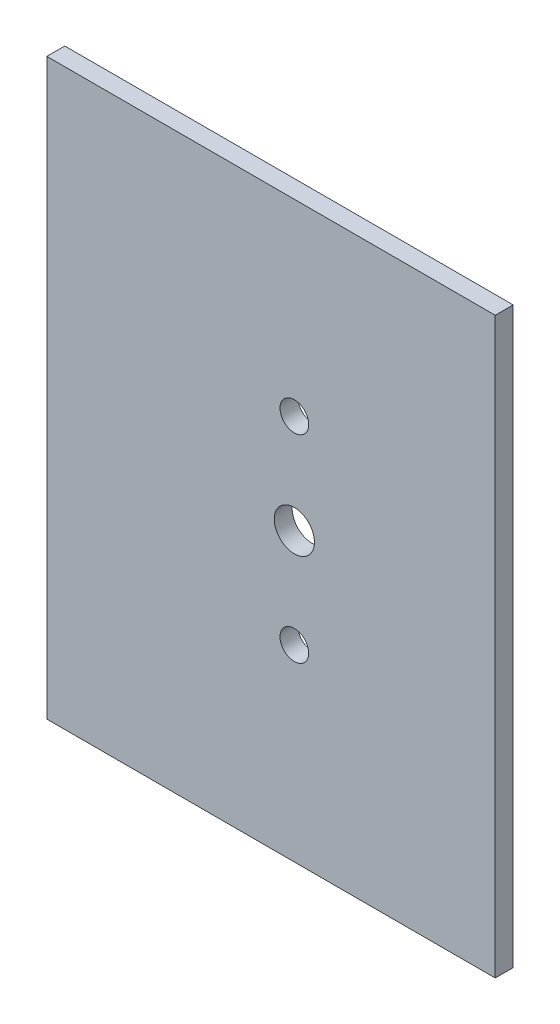
ISO-10303-21;
HEADER;
FILE_DESCRIPTION(('STEP AP214'),'2;1');
FILE_NAME('part.step','',(''),(''),'','','');
FILE_SCHEMA(('AUTOMOTIVE_DESIGN { 1 0 10303 214 1 1 1 1 }'));
ENDSEC;
DATA;
#1=APPLICATION_CONTEXT('core data for automotive mechanical design processes');
#2=APPLICATION_PROTOCOL_DEFINITION('international standard','automotive_design',2000,#1);
#3=PRODUCT_CONTEXT('',#1,'mechanical');
#4=PRODUCT('Part','Part','',(#3));
#5=PRODUCT_RELATED_PRODUCT_CATEGORY('part','',(#4));
#6=PRODUCT_DEFINITION_FORMATION('','',#4);
#7=PRODUCT_DEFINITION_CONTEXT('part definition',#1,'design');
#8=PRODUCT_DEFINITION('design','',#6,#7);
#9=PRODUCT_DEFINITION_SHAPE('','',#8);
#10=(LENGTH_UNIT() NAMED_UNIT(*) SI_UNIT(.MILLI.,.METRE.));
#11=(NAMED_UNIT(*) PLANE_ANGLE_UNIT() SI_UNIT($,.RADIAN.));
#12=(NAMED_UNIT(*) SI_UNIT($,.STERADIAN.) SOLID_ANGLE_UNIT());
#13=UNCERTAINTY_MEASURE_WITH_UNIT(LENGTH_MEASURE(1.E-05),#10,'distance_accuracy_value','');
#14=(GEOMETRIC_REPRESENTATION_CONTEXT(3) GLOBAL_UNCERTAINTY_ASSIGNED_CONTEXT((#13)) GLOBAL_UNIT_ASSIGNED_CONTEXT((#10,
#11,#12)) REPRESENTATION_CONTEXT('',''));
#15=CARTESIAN_POINT('',(0.,0.,0.));
#16=DIRECTION('',(0.,0.,1.));
#17=DIRECTION('',(1.,0.,0.));
#18=AXIS2_PLACEMENT_3D('',#15,#16,#17);
#19=CARTESIAN_POINT('',(1.5875,25.4,9.8425));
#20=DIRECTION('',(0.,0.,-1.));
#21=DIRECTION('',(-1.,0.,0.));
#22=AXIS2_PLACEMENT_3D('',#19,#20,#21);
#23=PLANE('',#22);
#24=DIRECTION('',(0.,1.,0.));
#25=VECTOR('',#24,1.);
#26=CARTESIAN_POINT('',(0.,0.,9.8425));
#27=LINE('',#26,#25);
#28=CARTESIAN_POINT('',(0.,-25.4,9.8425));
#29=VERTEX_POINT('',#28);
#30=CARTESIAN_POINT('',(0.,25.4,9.8425));
#31=VERTEX_POINT('',#30);
#32=EDGE_CURVE('E102',#29,#31,#27,.T.);
#33=ORIENTED_EDGE('',*,*,#32,.T.);
#34=DIRECTION('',(-1.,0.,0.));
#35=VECTOR('',#34,1.);
#36=CARTESIAN_POINT('',(39.6875,25.4,9.8425));
#37=LINE('',#36,#35);
#38=CARTESIAN_POINT('',(39.6875,25.4,9.8425));
#39=VERTEX_POINT('',#38);
#40=EDGE_CURVE('E86',#39,#31,#37,.T.);
#41=ORIENTED_EDGE('',*,*,#40,.F.);
#42=DIRECTION('',(0.,1.,0.));
#43=VECTOR('',#42,1.);
#44=CARTESIAN_POINT('',(39.6875,-25.4,9.8425));
#45=LINE('',#44,#43);
#46=CARTESIAN_POINT('',(39.6875,-25.4,9.8425));
#47=VERTEX_POINT('',#46);
#48=EDGE_CURVE('E137',#47,#39,#45,.T.);
#49=ORIENTED_EDGE('',*,*,#48,.F.);
#50=DIRECTION('',(-1.,0.,0.));
#51=VECTOR('',#50,1.);
#52=CARTESIAN_POINT('',(39.6875,-25.4,9.8425));
#53=LINE('',#52,#51);
#54=EDGE_CURVE('E97',#47,#29,#53,.T.);
#55=ORIENTED_EDGE('',*,*,#54,.T.);
#56=EDGE_LOOP('',(#33,#41,#49,#55));
#57=FACE_BOUND('',#56,.T.);
#58=CARTESIAN_POINT('',(21.9075,-8.763,9.8425));
#59=DIRECTION('',(0.,0.,1.));
#60=DIRECTION('',(1.,0.,0.));
#61=AXIS2_PLACEMENT_3D('',#58,#59,#60);
#62=CIRCLE('',#61,1.27);
#63=CARTESIAN_POINT('',(23.1775,-8.763,9.8425));
#64=VERTEX_POINT('',#63);
#65=EDGE_CURVE('E50',#64,#64,#62,.F.);
#66=ORIENTED_EDGE('',*,*,#65,.F.);
#67=EDGE_LOOP('',(#66));
#68=FACE_BOUND('',#67,.T.);
#69=CARTESIAN_POINT('',(21.9075,8.763,9.8425));
#70=DIRECTION('',(0.,0.,1.));
#71=DIRECTION('',(1.,0.,0.));
#72=AXIS2_PLACEMENT_3D('',#69,#70,#71);
#73=CIRCLE('',#72,1.27);
#74=CARTESIAN_POINT('',(23.1775,8.763,9.8425));
#75=VERTEX_POINT('',#74);
#76=EDGE_CURVE('E117',#75,#75,#73,.F.);
#77=ORIENTED_EDGE('',*,*,#76,.F.);
#78=EDGE_LOOP('',(#77));
#79=FACE_BOUND('',#78,.T.);
#80=CARTESIAN_POINT('',(21.9075,0.,9.8425));
#81=DIRECTION('',(0.,0.,1.));
#82=DIRECTION('',(1.,0.,0.));
#83=AXIS2_PLACEMENT_3D('',#80,#81,#82);
#84=CIRCLE('',#83,1.778);
#85=CARTESIAN_POINT('',(23.6855,0.,9.8425));
#86=VERTEX_POINT('',#85);
#87=EDGE_CURVE('E128',#86,#86,#84,.F.);
#88=ORIENTED_EDGE('',*,*,#87,.F.);
#89=EDGE_LOOP('',(#88));
#90=FACE_BOUND('',#89,.T.);
#91=ADVANCED_FACE('F40',(#57,#68,#79,#90),#23,.T.);
#92=CARTESIAN_POINT('',(0.,0.,0.));
#93=DIRECTION('',(1.,0.,0.));
#94=DIRECTION('',(0.,0.,-1.));
#95=AXIS2_PLACEMENT_3D('',#92,#93,#94);
#96=PLANE('',#95);
#97=ORIENTED_EDGE('',*,*,#32,.F.);
#98=DIRECTION('',(0.,0.,-1.));
#99=VECTOR('',#98,1.);
#100=CARTESIAN_POINT('',(0.,-25.4,-11.43));
#101=LINE('',#100,#99);
#102=CARTESIAN_POINT('',(0.,-25.4,11.43));
#103=VERTEX_POINT('',#102);
#104=EDGE_CURVE('E44',#103,#29,#101,.T.);
#105=ORIENTED_EDGE('',*,*,#104,.F.);
#106=DIRECTION('',(0.,-1.,0.));
#107=VECTOR('',#106,1.);
#108=CARTESIAN_POINT('',(0.,-25.4,11.43));
#109=LINE('',#108,#107);
#110=CARTESIAN_POINT('',(0.,25.4,11.43));
#111=VERTEX_POINT('',#110);
#112=EDGE_CURVE('E103',#111,#103,#109,.T.);
#113=ORIENTED_EDGE('',*,*,#112,.F.);
#114=DIRECTION('',(0.,0.,1.));
#115=VECTOR('',#114,1.);
#116=CARTESIAN_POINT('',(0.,25.4,-11.43));
#117=LINE('',#116,#115);
#118=EDGE_CURVE('E89',#31,#111,#117,.T.);
#119=ORIENTED_EDGE('',*,*,#118,.F.);
#120=EDGE_LOOP('',(#97,#105,#113,#119));
#121=FACE_BOUND('',#120,.T.);
#122=ADVANCED_FACE('F42',(#121),#96,.F.);
#123=CARTESIAN_POINT('',(1.5875,25.4,-11.43));
#124=DIRECTION('',(0.,-1.,0.));
#125=DIRECTION('',(0.,0.,-1.));
#126=AXIS2_PLACEMENT_3D('',#123,#124,#125);
#127=PLANE('',#126);
#128=ORIENTED_EDGE('',*,*,#40,.T.);
#129=ORIENTED_EDGE('',*,*,#118,.T.);
#130=DIRECTION('',(-1.,0.,0.));
#131=VECTOR('',#130,1.);
#132=CARTESIAN_POINT('',(1.5875,25.4,11.43));
#133=LINE('',#132,#131);
#134=CARTESIAN_POINT('',(39.6875,25.4,11.43));
#135=VERTEX_POINT('',#134);
#136=EDGE_CURVE('E105',#135,#111,#133,.T.);
#137=ORIENTED_EDGE('',*,*,#136,.F.);
#138=DIRECTION('',(0.,0.,1.));
#139=VECTOR('',#138,1.);
#140=CARTESIAN_POINT('',(39.6875,25.4,11.43));
#141=LINE('',#140,#139);
#142=EDGE_CURVE('E92',#39,#135,#141,.T.);
#143=ORIENTED_EDGE('',*,*,#142,.F.);
#144=EDGE_LOOP('',(#128,#129,#137,#143));
#145=FACE_BOUND('',#144,.T.);
#146=ADVANCED_FACE('F88',(#145),#127,.F.);
#147=CARTESIAN_POINT('',(1.5875,-25.4,-11.43));
#148=DIRECTION('',(0.,1.,0.));
#149=DIRECTION('',(0.,0.,1.));
#150=AXIS2_PLACEMENT_3D('',#147,#148,#149);
#151=PLANE('',#150);
#152=ORIENTED_EDGE('',*,*,#104,.T.);
#153=ORIENTED_EDGE('',*,*,#54,.F.);
#154=DIRECTION('',(0.,0.,-1.));
#155=VECTOR('',#154,1.);
#156=CARTESIAN_POINT('',(39.6875,-25.4,11.43));
#157=LINE('',#156,#155);
#158=CARTESIAN_POINT('',(39.6875,-25.4,11.43));
#159=VERTEX_POINT('',#158);
#160=EDGE_CURVE('E65',#159,#47,#157,.T.);
#161=ORIENTED_EDGE('',*,*,#160,.F.);
#162=DIRECTION('',(-1.,0.,0.));
#163=VECTOR('',#162,1.);
#164=CARTESIAN_POINT('',(1.5875,-25.4,11.43));
#165=LINE('',#164,#163);
#166=EDGE_CURVE('E58',#159,#103,#165,.T.);
#167=ORIENTED_EDGE('',*,*,#166,.T.);
#168=EDGE_LOOP('',(#152,#153,#161,#167));
#169=FACE_BOUND('',#168,.T.);
#170=ADVANCED_FACE('F165',(#169),#151,.F.);
#171=CARTESIAN_POINT('',(1.5875,-25.4,11.43));
#172=DIRECTION('',(0.,0.,-1.));
#173=DIRECTION('',(-1.,0.,0.));
#174=AXIS2_PLACEMENT_3D('',#171,#172,#173);
#175=PLANE('',#174);
#176=CARTESIAN_POINT('',(21.9075,-8.763,11.43));
#177=DIRECTION('',(0.,0.,1.));
#178=DIRECTION('',(1.,0.,0.));
#179=AXIS2_PLACEMENT_3D('',#176,#177,#178);
#180=CIRCLE('',#179,1.27);
#181=CARTESIAN_POINT('',(23.1775,-8.763,11.43));
#182=VERTEX_POINT('',#181);
#183=EDGE_CURVE('E12',#182,#182,#180,.T.);
#184=ORIENTED_EDGE('',*,*,#183,.F.);
#185=EDGE_LOOP('',(#184));
#186=FACE_BOUND('',#185,.T.);
#187=CARTESIAN_POINT('',(21.9075,8.763,11.43));
#188=DIRECTION('',(0.,0.,1.));
#189=DIRECTION('',(1.,0.,0.));
#190=AXIS2_PLACEMENT_3D('',#187,#188,#189);
#191=CIRCLE('',#190,1.27);
#192=CARTESIAN_POINT('',(23.1775,8.763,11.43));
#193=VERTEX_POINT('',#192);
#194=EDGE_CURVE('E113',#193,#193,#191,.T.);
#195=ORIENTED_EDGE('',*,*,#194,.F.);
#196=EDGE_LOOP('',(#195));
#197=FACE_BOUND('',#196,.T.);
#198=CARTESIAN_POINT('',(21.9075,0.,11.43));
#199=DIRECTION('',(0.,0.,1.));
#200=DIRECTION('',(1.,0.,0.));
#201=AXIS2_PLACEMENT_3D('',#198,#199,#200);
#202=CIRCLE('',#201,1.778);
#203=CARTESIAN_POINT('',(23.6855,0.,11.43));
#204=VERTEX_POINT('',#203);
#205=EDGE_CURVE('E120',#204,#204,#202,.T.);
#206=ORIENTED_EDGE('',*,*,#205,.F.);
#207=EDGE_LOOP('',(#206));
#208=FACE_BOUND('',#207,.T.);
#209=ORIENTED_EDGE('',*,*,#112,.T.);
#210=ORIENTED_EDGE('',*,*,#166,.F.);
#211=DIRECTION('',(0.,-1.,0.));
#212=VECTOR('',#211,1.);
#213=CARTESIAN_POINT('',(39.6875,-25.4,11.43));
#214=LINE('',#213,#212);
#215=EDGE_CURVE('E132',#135,#159,#214,.T.);
#216=ORIENTED_EDGE('',*,*,#215,.F.);
#217=ORIENTED_EDGE('',*,*,#136,.T.);
#218=EDGE_LOOP('',(#209,#210,#216,#217));
#219=FACE_BOUND('',#218,.T.);
#220=ADVANCED_FACE('F147',(#186,#197,#208,#219),#175,.F.);
#221=CARTESIAN_POINT('',(21.9075,-8.763,-11.431));
#222=DIRECTION('',(0.,0.,1.));
#223=DIRECTION('',(1.,0.,0.));
#224=AXIS2_PLACEMENT_3D('',#221,#222,#223);
#225=CYLINDRICAL_SURFACE('',#224,1.27);
#226=CARTESIAN_POINT('',(23.1775,-8.763,11.43));
#227=CARTESIAN_POINT('',(23.1775,-8.763,11.4134635416667));
#228=CARTESIAN_POINT('',(23.1775,-8.763,11.3969270833333));
#229=CARTESIAN_POINT('',(23.1775,-8.763,11.3638541666667));
#230=CARTESIAN_POINT('',(23.1775,-8.763,11.3473177083333));
#231=CARTESIAN_POINT('',(23.1775,-8.763,11.3142447916667));
#232=CARTESIAN_POINT('',(23.1775,-8.763,11.2977083333333));
#233=CARTESIAN_POINT('',(23.1775,-8.763,11.2646354166667));
#234=CARTESIAN_POINT('',(23.1775,-8.763,11.2480989583333));
#235=CARTESIAN_POINT('',(23.1775,-8.763,11.2150260416667));
#236=CARTESIAN_POINT('',(23.1775,-8.763,11.1984895833333));
#237=CARTESIAN_POINT('',(23.1775,-8.763,11.1654166666667));
#238=CARTESIAN_POINT('',(23.1775,-8.763,11.1488802083333));
#239=CARTESIAN_POINT('',(23.1775,-8.763,11.1158072916667));
#240=CARTESIAN_POINT('',(23.1775,-8.763,11.0992708333333));
#241=CARTESIAN_POINT('',(23.1775,-8.763,11.0661979166667));
#242=CARTESIAN_POINT('',(23.1775,-8.763,11.0496614583333));
#243=CARTESIAN_POINT('',(23.1775,-8.763,11.0165885416667));
#244=CARTESIAN_POINT('',(23.1775,-8.763,11.0000520833333));
#245=CARTESIAN_POINT('',(23.1775,-8.763,10.9669791666667));
#246=CARTESIAN_POINT('',(23.1775,-8.763,10.9504427083333));
#247=CARTESIAN_POINT('',(23.1775,-8.763,10.9173697916667));
#248=CARTESIAN_POINT('',(23.1775,-8.763,10.9008333333333));
#249=CARTESIAN_POINT('',(23.1775,-8.763,10.8677604166667));
#250=CARTESIAN_POINT('',(23.1775,-8.763,10.8512239583333));
#251=CARTESIAN_POINT('',(23.1775,-8.763,10.8181510416667));
#252=CARTESIAN_POINT('',(23.1775,-8.763,10.8016145833333));
#253=CARTESIAN_POINT('',(23.1775,-8.763,10.7685416666667));
#254=CARTESIAN_POINT('',(23.1775,-8.763,10.7520052083333));
#255=CARTESIAN_POINT('',(23.1775,-8.763,10.7189322916667));
#256=CARTESIAN_POINT('',(23.1775,-8.763,10.7023958333333));
#257=CARTESIAN_POINT('',(23.1775,-8.763,10.6693229166667));
#258=CARTESIAN_POINT('',(23.1775,-8.763,10.6527864583333));
#259=CARTESIAN_POINT('',(23.1775,-8.763,10.6197135416667));
#260=CARTESIAN_POINT('',(23.1775,-8.763,10.6031770833333));
#261=CARTESIAN_POINT('',(23.1775,-8.763,10.5701041666667));
#262=CARTESIAN_POINT('',(23.1775,-8.763,10.5535677083333));
#263=CARTESIAN_POINT('',(23.1775,-8.763,10.5204947916667));
#264=CARTESIAN_POINT('',(23.1775,-8.763,10.5039583333333));
#265=CARTESIAN_POINT('',(23.1775,-8.763,10.4708854166667));
#266=CARTESIAN_POINT('',(23.1775,-8.763,10.4543489583333));
#267=CARTESIAN_POINT('',(23.1775,-8.763,10.4212760416667));
#268=CARTESIAN_POINT('',(23.1775,-8.763,10.4047395833333));
#269=CARTESIAN_POINT('',(23.1775,-8.763,10.3716666666667));
#270=CARTESIAN_POINT('',(23.1775,-8.763,10.3551302083333));
#271=CARTESIAN_POINT('',(23.1775,-8.763,10.3220572916667));
#272=CARTESIAN_POINT('',(23.1775,-8.763,10.3055208333333));
#273=CARTESIAN_POINT('',(23.1775,-8.763,10.2724479166667));
#274=CARTESIAN_POINT('',(23.1775,-8.763,10.2559114583333));
#275=CARTESIAN_POINT('',(23.1775,-8.763,10.2228385416667));
#276=CARTESIAN_POINT('',(23.1775,-8.763,10.2063020833333));
#277=CARTESIAN_POINT('',(23.1775,-8.763,10.1732291666667));
#278=CARTESIAN_POINT('',(23.1775,-8.763,10.1566927083333));
#279=CARTESIAN_POINT('',(23.1775,-8.763,10.1236197916667));
#280=CARTESIAN_POINT('',(23.1775,-8.763,10.1070833333333));
#281=CARTESIAN_POINT('',(23.1775,-8.763,10.0740104166667));
#282=CARTESIAN_POINT('',(23.1775,-8.763,10.0574739583333));
#283=CARTESIAN_POINT('',(23.1775,-8.763,10.0244010416667));
#284=CARTESIAN_POINT('',(23.1775,-8.763,10.0078645833333));
#285=CARTESIAN_POINT('',(23.1775,-8.763,9.97479166666666));
#286=CARTESIAN_POINT('',(23.1775,-8.763,9.95825520833333));
#287=CARTESIAN_POINT('',(23.1775,-8.763,9.92518229166666));
#288=CARTESIAN_POINT('',(23.1775,-8.763,9.90864583333333));
#289=CARTESIAN_POINT('',(23.1775,-8.763,9.87557291666666));
#290=CARTESIAN_POINT('',(23.1775,-8.763,9.85903645833333));
#291=CARTESIAN_POINT('',(23.1775,-8.763,9.8425));
#292=B_SPLINE_CURVE_WITH_KNOTS('',3,(#226,#227,#228,#229,#230,#231,#232,#233,#234,#235,#236,
#237,#238,#239,#240,#241,#242,#243,#244,#245,#246,#247,#248,#249,#250,#251,#252,#253,#254,#255,
#256,#257,#258,#259,#260,#261,#262,#263,#264,#265,#266,#267,#268,#269,#270,#271,#272,#273,#274,
#275,#276,#277,#278,#279,#280,#281,#282,#283,#284,#285,#286,#287,#288,#289,#290,#291),
.UNSPECIFIED.,.F.,.F.,(4,2,2,2,2,2,2,2,2,2,2,2,2,2,2,2,2,2,2,2,2,2,2,2,2,2,2,2,2,2,2,2,4),(0.,
0.0496093749999989,0.0992187500000012,0.148828125,0.198437499999999,0.248046875000001,
0.29765625,0.347265624999999,0.396874999999998,0.446484375,0.496093749999999,0.545703124999998,
0.5953125,0.644921874999999,0.694531249999998,0.744140625,0.793749999999999,0.843359374999998,
0.892968750000001,0.942578124999999,0.992187499999998,1.041796875,1.09140625,1.141015625,
1.190625,1.240234375,1.28984375,1.339453125,1.3890625,1.438671875,1.48828125,1.537890625,
1.5875),.UNSPECIFIED.);
#293=EDGE_CURVE('BSEAM174',#182,#64,#292,.T.);
#294=ORIENTED_EDGE('',*,*,#183,.T.);
#295=ORIENTED_EDGE('',*,*,#65,.T.);
#296=ORIENTED_EDGE('',*,*,#293,.T.);
#297=ORIENTED_EDGE('',*,*,#293,.F.);
#298=EDGE_LOOP('',(#294,#296,#295,#297));
#299=FACE_BOUND('',#298,.T.);
#300=ADVANCED_FACE('F174',(#299),#225,.F.);
#301=CARTESIAN_POINT('',(21.9075,8.763,-11.431));
#302=DIRECTION('',(0.,0.,1.));
#303=DIRECTION('',(1.,0.,0.));
#304=AXIS2_PLACEMENT_3D('',#301,#302,#303);
#305=CYLINDRICAL_SURFACE('',#304,1.27);
#306=CARTESIAN_POINT('',(23.1775,8.763,11.43));
#307=CARTESIAN_POINT('',(23.1775,8.763,11.4134635416667));
#308=CARTESIAN_POINT('',(23.1775,8.763,11.3969270833333));
#309=CARTESIAN_POINT('',(23.1775,8.763,11.3638541666667));
#310=CARTESIAN_POINT('',(23.1775,8.763,11.3473177083333));
#311=CARTESIAN_POINT('',(23.1775,8.763,11.3142447916667));
#312=CARTESIAN_POINT('',(23.1775,8.763,11.2977083333333));
#313=CARTESIAN_POINT('',(23.1775,8.763,11.2646354166667));
#314=CARTESIAN_POINT('',(23.1775,8.763,11.2480989583333));
#315=CARTESIAN_POINT('',(23.1775,8.763,11.2150260416667));
#316=CARTESIAN_POINT('',(23.1775,8.763,11.1984895833333));
#317=CARTESIAN_POINT('',(23.1775,8.763,11.1654166666667));
#318=CARTESIAN_POINT('',(23.1775,8.763,11.1488802083333));
#319=CARTESIAN_POINT('',(23.1775,8.763,11.1158072916667));
#320=CARTESIAN_POINT('',(23.1775,8.763,11.0992708333333));
#321=CARTESIAN_POINT('',(23.1775,8.763,11.0661979166667));
#322=CARTESIAN_POINT('',(23.1775,8.763,11.0496614583333));
#323=CARTESIAN_POINT('',(23.1775,8.763,11.0165885416667));
#324=CARTESIAN_POINT('',(23.1775,8.763,11.0000520833333));
#325=CARTESIAN_POINT('',(23.1775,8.763,10.9669791666667));
#326=CARTESIAN_POINT('',(23.1775,8.763,10.9504427083333));
#327=CARTESIAN_POINT('',(23.1775,8.763,10.9173697916667));
#328=CARTESIAN_POINT('',(23.1775,8.763,10.9008333333333));
#329=CARTESIAN_POINT('',(23.1775,8.763,10.8677604166667));
#330=CARTESIAN_POINT('',(23.1775,8.763,10.8512239583333));
#331=CARTESIAN_POINT('',(23.1775,8.763,10.8181510416667));
#332=CARTESIAN_POINT('',(23.1775,8.763,10.8016145833333));
#333=CARTESIAN_POINT('',(23.1775,8.763,10.7685416666667));
#334=CARTESIAN_POINT('',(23.1775,8.763,10.7520052083333));
#335=CARTESIAN_POINT('',(23.1775,8.763,10.7189322916667));
#336=CARTESIAN_POINT('',(23.1775,8.763,10.7023958333333));
#337=CARTESIAN_POINT('',(23.1775,8.763,10.6693229166667));
#338=CARTESIAN_POINT('',(23.1775,8.763,10.6527864583333));
#339=CARTESIAN_POINT('',(23.1775,8.763,10.6197135416667));
#340=CARTESIAN_POINT('',(23.1775,8.763,10.6031770833333));
#341=CARTESIAN_POINT('',(23.1775,8.763,10.5701041666667));
#342=CARTESIAN_POINT('',(23.1775,8.763,10.5535677083333));
#343=CARTESIAN_POINT('',(23.1775,8.763,10.5204947916667));
#344=CARTESIAN_POINT('',(23.1775,8.763,10.5039583333333));
#345=CARTESIAN_POINT('',(23.1775,8.763,10.4708854166667));
#346=CARTESIAN_POINT('',(23.1775,8.763,10.4543489583333));
#347=CARTESIAN_POINT('',(23.1775,8.763,10.4212760416667));
#348=CARTESIAN_POINT('',(23.1775,8.763,10.4047395833333));
#349=CARTESIAN_POINT('',(23.1775,8.763,10.3716666666667));
#350=CARTESIAN_POINT('',(23.1775,8.763,10.3551302083333));
#351=CARTESIAN_POINT('',(23.1775,8.763,10.3220572916667));
#352=CARTESIAN_POINT('',(23.1775,8.763,10.3055208333333));
#353=CARTESIAN_POINT('',(23.1775,8.763,10.2724479166667));
#354=CARTESIAN_POINT('',(23.1775,8.763,10.2559114583333));
#355=CARTESIAN_POINT('',(23.1775,8.763,10.2228385416667));
#356=CARTESIAN_POINT('',(23.1775,8.763,10.2063020833333));
#357=CARTESIAN_POINT('',(23.1775,8.763,10.1732291666667));
#358=CARTESIAN_POINT('',(23.1775,8.763,10.1566927083333));
#359=CARTESIAN_POINT('',(23.1775,8.763,10.1236197916667));
#360=CARTESIAN_POINT('',(23.1775,8.763,10.1070833333333));
#361=CARTESIAN_POINT('',(23.1775,8.763,10.0740104166667));
#362=CARTESIAN_POINT('',(23.1775,8.763,10.0574739583333));
#363=CARTESIAN_POINT('',(23.1775,8.763,10.0244010416667));
#364=CARTESIAN_POINT('',(23.1775,8.763,10.0078645833333));
#365=CARTESIAN_POINT('',(23.1775,8.763,9.97479166666666));
#366=CARTESIAN_POINT('',(23.1775,8.763,9.95825520833333));
#367=CARTESIAN_POINT('',(23.1775,8.763,9.92518229166666));
#368=CARTESIAN_POINT('',(23.1775,8.763,9.90864583333333));
#369=CARTESIAN_POINT('',(23.1775,8.763,9.87557291666666));
#370=CARTESIAN_POINT('',(23.1775,8.763,9.85903645833333));
#371=CARTESIAN_POINT('',(23.1775,8.763,9.8425));
#372=B_SPLINE_CURVE_WITH_KNOTS('',3,(#306,#307,#308,#309,#310,#311,#312,#313,#314,#315,#316,
#317,#318,#319,#320,#321,#322,#323,#324,#325,#326,#327,#328,#329,#330,#331,#332,#333,#334,#335,
#336,#337,#338,#339,#340,#341,#342,#343,#344,#345,#346,#347,#348,#349,#350,#351,#352,#353,#354,
#355,#356,#357,#358,#359,#360,#361,#362,#363,#364,#365,#366,#367,#368,#369,#370,#371),
.UNSPECIFIED.,.F.,.F.,(4,2,2,2,2,2,2,2,2,2,2,2,2,2,2,2,2,2,2,2,2,2,2,2,2,2,2,2,2,2,2,2,4),(0.,
0.0496093749999989,0.0992187500000012,0.148828125,0.198437499999999,0.248046875000001,
0.29765625,0.347265624999999,0.396874999999998,0.446484375,0.496093749999999,0.545703124999998,
0.5953125,0.644921874999999,0.694531249999998,0.744140625,0.793749999999999,0.843359374999998,
0.892968750000001,0.942578124999999,0.992187499999998,1.041796875,1.09140625,1.141015625,
1.190625,1.240234375,1.28984375,1.339453125,1.3890625,1.438671875,1.48828125,1.537890625,
1.5875),.UNSPECIFIED.);
#373=EDGE_CURVE('BSEAM155',#193,#75,#372,.T.);
#374=ORIENTED_EDGE('',*,*,#194,.T.);
#375=ORIENTED_EDGE('',*,*,#76,.T.);
#376=ORIENTED_EDGE('',*,*,#373,.T.);
#377=ORIENTED_EDGE('',*,*,#373,.F.);
#378=EDGE_LOOP('',(#374,#376,#375,#377));
#379=FACE_BOUND('',#378,.T.);
#380=ADVANCED_FACE('F155',(#379),#305,.F.);
#381=CARTESIAN_POINT('',(21.9075,0.,-11.431));
#382=DIRECTION('',(0.,0.,1.));
#383=DIRECTION('',(1.,0.,0.));
#384=AXIS2_PLACEMENT_3D('',#381,#382,#383);
#385=CYLINDRICAL_SURFACE('',#384,1.778);
#386=CARTESIAN_POINT('',(23.6855,0.,11.43));
#387=CARTESIAN_POINT('',(23.6855,0.,11.4134635416667));
#388=CARTESIAN_POINT('',(23.6855,0.,11.3969270833333));
#389=CARTESIAN_POINT('',(23.6855,0.,11.3638541666667));
#390=CARTESIAN_POINT('',(23.6855,0.,11.3473177083333));
#391=CARTESIAN_POINT('',(23.6855,0.,11.3142447916667));
#392=CARTESIAN_POINT('',(23.6855,0.,11.2977083333333));
#393=CARTESIAN_POINT('',(23.6855,0.,11.2646354166667));
#394=CARTESIAN_POINT('',(23.6855,0.,11.2480989583333));
#395=CARTESIAN_POINT('',(23.6855,0.,11.2150260416667));
#396=CARTESIAN_POINT('',(23.6855,0.,11.1984895833333));
#397=CARTESIAN_POINT('',(23.6855,0.,11.1654166666667));
#398=CARTESIAN_POINT('',(23.6855,0.,11.1488802083333));
#399=CARTESIAN_POINT('',(23.6855,0.,11.1158072916667));
#400=CARTESIAN_POINT('',(23.6855,0.,11.0992708333333));
#401=CARTESIAN_POINT('',(23.6855,0.,11.0661979166667));
#402=CARTESIAN_POINT('',(23.6855,0.,11.0496614583333));
#403=CARTESIAN_POINT('',(23.6855,0.,11.0165885416667));
#404=CARTESIAN_POINT('',(23.6855,0.,11.0000520833333));
#405=CARTESIAN_POINT('',(23.6855,0.,10.9669791666667));
#406=CARTESIAN_POINT('',(23.6855,0.,10.9504427083333));
#407=CARTESIAN_POINT('',(23.6855,0.,10.9173697916667));
#408=CARTESIAN_POINT('',(23.6855,0.,10.9008333333333));
#409=CARTESIAN_POINT('',(23.6855,0.,10.8677604166667));
#410=CARTESIAN_POINT('',(23.6855,0.,10.8512239583333));
#411=CARTESIAN_POINT('',(23.6855,0.,10.8181510416667));
#412=CARTESIAN_POINT('',(23.6855,0.,10.8016145833333));
#413=CARTESIAN_POINT('',(23.6855,0.,10.7685416666667));
#414=CARTESIAN_POINT('',(23.6855,0.,10.7520052083333));
#415=CARTESIAN_POINT('',(23.6855,0.,10.7189322916667));
#416=CARTESIAN_POINT('',(23.6855,0.,10.7023958333333));
#417=CARTESIAN_POINT('',(23.6855,0.,10.6693229166667));
#418=CARTESIAN_POINT('',(23.6855,0.,10.6527864583333));
#419=CARTESIAN_POINT('',(23.6855,0.,10.6197135416667));
#420=CARTESIAN_POINT('',(23.6855,0.,10.6031770833333));
#421=CARTESIAN_POINT('',(23.6855,0.,10.5701041666667));
#422=CARTESIAN_POINT('',(23.6855,0.,10.5535677083333));
#423=CARTESIAN_POINT('',(23.6855,0.,10.5204947916667));
#424=CARTESIAN_POINT('',(23.6855,0.,10.5039583333333));
#425=CARTESIAN_POINT('',(23.6855,0.,10.4708854166667));
#426=CARTESIAN_POINT('',(23.6855,0.,10.4543489583333));
#427=CARTESIAN_POINT('',(23.6855,0.,10.4212760416667));
#428=CARTESIAN_POINT('',(23.6855,0.,10.4047395833333));
#429=CARTESIAN_POINT('',(23.6855,0.,10.3716666666667));
#430=CARTESIAN_POINT('',(23.6855,0.,10.3551302083333));
#431=CARTESIAN_POINT('',(23.6855,0.,10.3220572916667));
#432=CARTESIAN_POINT('',(23.6855,0.,10.3055208333333));
#433=CARTESIAN_POINT('',(23.6855,0.,10.2724479166667));
#434=CARTESIAN_POINT('',(23.6855,0.,10.2559114583333));
#435=CARTESIAN_POINT('',(23.6855,0.,10.2228385416667));
#436=CARTESIAN_POINT('',(23.6855,0.,10.2063020833333));
#437=CARTESIAN_POINT('',(23.6855,0.,10.1732291666667));
#438=CARTESIAN_POINT('',(23.6855,0.,10.1566927083333));
#439=CARTESIAN_POINT('',(23.6855,0.,10.1236197916667));
#440=CARTESIAN_POINT('',(23.6855,0.,10.1070833333333));
#441=CARTESIAN_POINT('',(23.6855,0.,10.0740104166667));
#442=CARTESIAN_POINT('',(23.6855,0.,10.0574739583333));
#443=CARTESIAN_POINT('',(23.6855,0.,10.0244010416667));
#444=CARTESIAN_POINT('',(23.6855,0.,10.0078645833333));
#445=CARTESIAN_POINT('',(23.6855,0.,9.97479166666666));
#446=CARTESIAN_POINT('',(23.6855,0.,9.95825520833333));
#447=CARTESIAN_POINT('',(23.6855,0.,9.92518229166666));
#448=CARTESIAN_POINT('',(23.6855,0.,9.90864583333333));
#449=CARTESIAN_POINT('',(23.6855,0.,9.87557291666666));
#450=CARTESIAN_POINT('',(23.6855,0.,9.85903645833333));
#451=CARTESIAN_POINT('',(23.6855,0.,9.8425));
#452=B_SPLINE_CURVE_WITH_KNOTS('',3,(#386,#387,#388,#389,#390,#391,#392,#393,#394,#395,#396,
#397,#398,#399,#400,#401,#402,#403,#404,#405,#406,#407,#408,#409,#410,#411,#412,#413,#414,#415,
#416,#417,#418,#419,#420,#421,#422,#423,#424,#425,#426,#427,#428,#429,#430,#431,#432,#433,#434,
#435,#436,#437,#438,#439,#440,#441,#442,#443,#444,#445,#446,#447,#448,#449,#450,#451),
.UNSPECIFIED.,.F.,.F.,(4,2,2,2,2,2,2,2,2,2,2,2,2,2,2,2,2,2,2,2,2,2,2,2,2,2,2,2,2,2,2,2,4),(0.,
0.0496093749999989,0.0992187500000012,0.148828125,0.198437499999999,0.248046875000001,
0.29765625,0.347265624999999,0.396874999999998,0.446484375,0.496093749999999,0.545703124999998,
0.5953125,0.644921874999999,0.694531249999998,0.744140625,0.793749999999999,0.843359374999998,
0.892968750000001,0.942578124999999,0.992187499999998,1.041796875,1.09140625,1.141015625,
1.190625,1.240234375,1.28984375,1.339453125,1.3890625,1.438671875,1.48828125,1.537890625,
1.5875),.UNSPECIFIED.);
#453=EDGE_CURVE('BSEAM150',#204,#86,#452,.T.);
#454=ORIENTED_EDGE('',*,*,#205,.T.);
#455=ORIENTED_EDGE('',*,*,#87,.T.);
#456=ORIENTED_EDGE('',*,*,#453,.T.);
#457=ORIENTED_EDGE('',*,*,#453,.F.);
#458=EDGE_LOOP('',(#454,#456,#455,#457));
#459=FACE_BOUND('',#458,.T.);
#460=ADVANCED_FACE('F150',(#459),#385,.F.);
#461=CARTESIAN_POINT('',(39.6875,0.,0.));
#462=DIRECTION('',(-1.,0.,0.));
#463=DIRECTION('',(0.,0.,1.));
#464=AXIS2_PLACEMENT_3D('',#461,#462,#463);
#465=PLANE('',#464);
#466=ORIENTED_EDGE('',*,*,#215,.T.);
#467=ORIENTED_EDGE('',*,*,#160,.T.);
#468=ORIENTED_EDGE('',*,*,#48,.T.);
#469=ORIENTED_EDGE('',*,*,#142,.T.);
#470=EDGE_LOOP('',(#466,#467,#468,#469));
#471=FACE_BOUND('',#470,.T.);
#472=ADVANCED_FACE('F148',(#471),#465,.F.);
#473=CLOSED_SHELL('',(#91,#122,#146,#170,#220,#300,#380,#460,#472));
#474=MANIFOLD_SOLID_BREP('B2',#473);
#475=ADVANCED_BREP_SHAPE_REPRESENTATION('',(#18,#474),#14);
#476=SHAPE_DEFINITION_REPRESENTATION(#9,#475);
ENDSEC;
END-ISO-10303-21;
